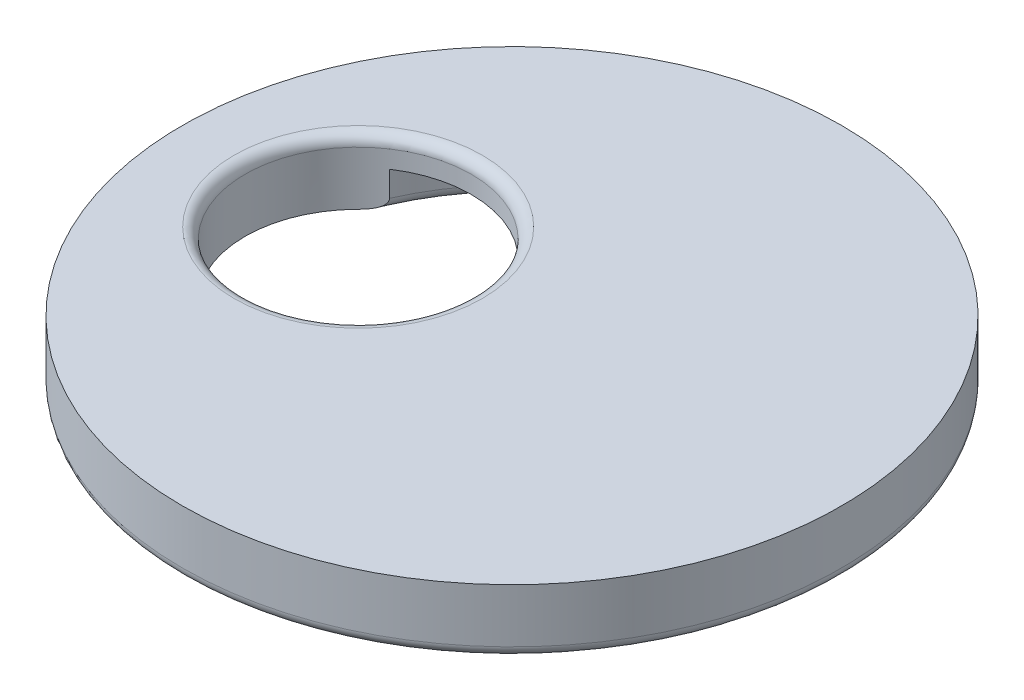
ISO-10303-21;
HEADER;
FILE_DESCRIPTION(('STEP AP214'),'2;1');
FILE_NAME('part.step','',(''),(''),'','','');
FILE_SCHEMA(('AUTOMOTIVE_DESIGN { 1 0 10303 214 1 1 1 1 }'));
ENDSEC;
DATA;
#1=APPLICATION_CONTEXT('core data for automotive mechanical design processes');
#2=APPLICATION_PROTOCOL_DEFINITION('international standard','automotive_design',2000,#1);
#3=PRODUCT_CONTEXT('',#1,'mechanical');
#4=PRODUCT('Part','Part','',(#3));
#5=PRODUCT_RELATED_PRODUCT_CATEGORY('part','',(#4));
#6=PRODUCT_DEFINITION_FORMATION('','',#4);
#7=PRODUCT_DEFINITION_CONTEXT('part definition',#1,'design');
#8=PRODUCT_DEFINITION('design','',#6,#7);
#9=PRODUCT_DEFINITION_SHAPE('','',#8);
#10=(LENGTH_UNIT() NAMED_UNIT(*) SI_UNIT(.MILLI.,.METRE.));
#11=(NAMED_UNIT(*) PLANE_ANGLE_UNIT() SI_UNIT($,.RADIAN.));
#12=(NAMED_UNIT(*) SI_UNIT($,.STERADIAN.) SOLID_ANGLE_UNIT());
#13=UNCERTAINTY_MEASURE_WITH_UNIT(LENGTH_MEASURE(1.E-05),#10,'distance_accuracy_value','');
#14=(GEOMETRIC_REPRESENTATION_CONTEXT(3) GLOBAL_UNCERTAINTY_ASSIGNED_CONTEXT((#13)) GLOBAL_UNIT_ASSIGNED_CONTEXT((#10,
#11,#12)) REPRESENTATION_CONTEXT('',''));
#15=CARTESIAN_POINT('',(0.,0.,0.));
#16=DIRECTION('',(0.,0.,1.));
#17=DIRECTION('',(1.,0.,0.));
#18=AXIS2_PLACEMENT_3D('',#15,#16,#17);
#19=CARTESIAN_POINT('',(0.,0.,0.));
#20=DIRECTION('',(0.,1.,0.));
#21=DIRECTION('',(0.,0.,1.));
#22=AXIS2_PLACEMENT_3D('',#19,#20,#21);
#23=PLANE('',#22);
#24=CARTESIAN_POINT('',(0.,0.,0.));
#25=DIRECTION('',(0.,1.,0.));
#26=DIRECTION('',(0.,0.,1.));
#27=AXIS2_PLACEMENT_3D('',#24,#25,#26);
#28=CIRCLE('',#27,10.75);
#29=CARTESIAN_POINT('',(-9.86,0.,4.28286119317449));
#30=VERTEX_POINT('',#29);
#31=CARTESIAN_POINT('',(-9.86,0.,-4.28286119317449));
#32=VERTEX_POINT('',#31);
#33=EDGE_CURVE('E77',#30,#32,#28,.T.);
#34=ORIENTED_EDGE('',*,*,#33,.F.);
#35=CARTESIAN_POINT('',(-7.,0.,0.));
#36=DIRECTION('',(0.,1.,0.));
#37=DIRECTION('',(0.,0.,1.));
#38=AXIS2_PLACEMENT_3D('',#35,#36,#37);
#39=CIRCLE('',#38,5.15);
#40=EDGE_CURVE('E85',#30,#32,#39,.T.);
#41=ORIENTED_EDGE('',*,*,#40,.T.);
#42=EDGE_LOOP('',(#34,#41));
#43=FACE_BOUND('',#42,.T.);
#44=ADVANCED_FACE('F42',(#43),#23,.F.);
#45=CARTESIAN_POINT('',(-7.,1.3,0.));
#46=DIRECTION('',(0.,-1.,0.));
#47=DIRECTION('',(0.,0.,-1.));
#48=AXIS2_PLACEMENT_3D('',#45,#46,#47);
#49=CYLINDRICAL_SURFACE('',#48,5.15);
#50=CARTESIAN_POINT('',(-7.,0.8,0.));
#51=DIRECTION('',(0.,1.,0.));
#52=DIRECTION('',(0.,0.,1.));
#53=AXIS2_PLACEMENT_3D('',#50,#51,#52);
#54=CIRCLE('',#53,5.15);
#55=CARTESIAN_POINT('',(-7.,0.8,5.15));
#56=VERTEX_POINT('',#55);
#57=EDGE_CURVE('E86',#56,#56,#54,.T.);
#58=ORIENTED_EDGE('',*,*,#57,.T.);
#59=EDGE_LOOP('',(#58));
#60=FACE_BOUND('',#59,.T.);
#61=CARTESIAN_POINT('',(-7.,-1.65,0.));
#62=DIRECTION('',(0.,1.,0.));
#63=DIRECTION('',(0.,0.,1.));
#64=AXIS2_PLACEMENT_3D('',#61,#62,#63);
#65=CIRCLE('',#64,5.15);
#66=CARTESIAN_POINT('',(-10.6457142857143,-1.65,-3.6374809067456));
#67=VERTEX_POINT('',#66);
#68=CARTESIAN_POINT('',(-10.6457142857143,-1.65,3.6374809067456));
#69=VERTEX_POINT('',#68);
#70=EDGE_CURVE('E81',#67,#69,#65,.T.);
#71=ORIENTED_EDGE('',*,*,#70,.F.);
#72=CARTESIAN_POINT('',(-10.6457142857143,-1.65,-3.6374809067456));
#73=CARTESIAN_POINT('',(-10.6089557136245,-1.64996611674412,-3.67433289593063));
#74=CARTESIAN_POINT('',(-10.5715983490033,-1.64842590090176,-3.71064772213373));
#75=CARTESIAN_POINT('',(-10.4957370130442,-1.64174397657124,-3.78220025025339));
#76=CARTESIAN_POINT('',(-10.4572272560529,-1.63657940180842,-3.8174296228198));
#77=CARTESIAN_POINT('',(-10.3791250164166,-1.62195910434838,-3.88674379817724));
#78=CARTESIAN_POINT('',(-10.3395251000964,-1.61245298273011,-3.92080996053041));
#79=CARTESIAN_POINT('',(-10.2603388803773,-1.58821776234701,-3.98689486010416));
#80=CARTESIAN_POINT('',(-10.220752889305,-1.57350434164138,-4.01891940631929));
#81=CARTESIAN_POINT('',(-10.159360452529,-1.54520090062229,-4.06715515825471));
#82=CARTESIAN_POINT('',(-10.1372201989455,-1.53384261734052,-4.08425056779766));
#83=CARTESIAN_POINT('',(-10.0935962837302,-1.50860036132807,-4.11739109482864));
#84=CARTESIAN_POINT('',(-10.0721122800573,-1.49471773147162,-4.13343676460386));
#85=CARTESIAN_POINT('',(-10.0301225046417,-1.46384349321468,-4.16431779207818));
#86=CARTESIAN_POINT('',(-10.0096270351508,-1.44682553735272,-4.17914122334314));
#87=CARTESIAN_POINT('',(-9.9706996021452,-1.40922568617012,-4.20690035354195));
#88=CARTESIAN_POINT('',(-9.95226335904804,-1.38865141748679,-4.21983998513581));
#89=CARTESIAN_POINT('',(-9.92512174453921,-1.35193483527052,-4.23867045466016));
#90=CARTESIAN_POINT('',(-9.91535403109541,-1.33700799583032,-4.24538875312143));
#91=CARTESIAN_POINT('',(-9.89769671025232,-1.30555747739975,-4.25746024473099));
#92=CARTESIAN_POINT('',(-9.88980544148874,-1.28903522931484,-4.2628146457466));
#93=CARTESIAN_POINT('',(-9.87745895810687,-1.25707520041382,-4.27115644668831));
#94=CARTESIAN_POINT('',(-9.87267136612987,-1.24182775714362,-4.27437453049847));
#95=CARTESIAN_POINT('',(-9.8652786760813,-1.21059899730107,-4.27933398246775));
#96=CARTESIAN_POINT('',(-9.8626684149693,-1.19461951215542,-4.28107884415571));
#97=CARTESIAN_POINT('',(-9.86041437847799,-1.16903164599226,-4.2825843214463));
#98=CARTESIAN_POINT('',(-9.85999092344709,-1.15951550669135,-4.28286664431448));
#99=CARTESIAN_POINT('',(-9.86,-1.15,-4.28286119317449));
#100=B_SPLINE_CURVE_WITH_KNOTS('',3,(#72,#73,#74,#75,#76,#77,#78,#79,#80,#81,#82,#83,#84,#85,
#86,#87,#88,#89,#90,#91,#92,#93,#94,#95,#96,#97,#98,#99),.UNSPECIFIED.,.F.,.F.,(4,2,2,2,2,2,2,2,
2,2,2,2,2,4),(0.,0.156190303059865,0.313374982973884,0.472432635019737,0.631015416503463,
0.72148621711328,0.811909030113762,0.903129569136118,0.994156856085308,1.05118002073822,
1.10815250872515,1.15686083557314,1.20545333079016,1.23399206052246),.UNSPECIFIED.);
#101=CARTESIAN_POINT('',(-9.86,-1.15,-4.28286119317449));
#102=VERTEX_POINT('',#101);
#103=EDGE_CURVE('E57',#67,#102,#100,.T.);
#104=ORIENTED_EDGE('',*,*,#103,.T.);
#105=DIRECTION('',(0.,1.,0.));
#106=VECTOR('',#105,1.);
#107=CARTESIAN_POINT('',(-9.86,-1.65,-4.28286119317449));
#108=LINE('',#107,#106);
#109=EDGE_CURVE('E80',#102,#32,#108,.T.);
#110=ORIENTED_EDGE('',*,*,#109,.T.);
#111=ORIENTED_EDGE('',*,*,#40,.F.);
#112=DIRECTION('',(0.,1.,0.));
#113=VECTOR('',#112,1.);
#114=CARTESIAN_POINT('',(-9.86,-1.65,4.28286119317449));
#115=LINE('',#114,#113);
#116=CARTESIAN_POINT('',(-9.86,-1.15,4.28286119317449));
#117=VERTEX_POINT('',#116);
#118=EDGE_CURVE('E74',#117,#30,#115,.T.);
#119=ORIENTED_EDGE('',*,*,#118,.F.);
#120=CARTESIAN_POINT('',(-9.86,-1.15,4.28286119317449));
#121=CARTESIAN_POINT('',(-9.85996748253735,-1.16617725907413,4.28288043979074));
#122=CARTESIAN_POINT('',(-9.8612038318693,-1.18231387853373,4.28205738160039));
#123=CARTESIAN_POINT('',(-9.86593131796034,-1.21396602525333,4.27889600484977));
#124=CARTESIAN_POINT('',(-9.86940321177531,-1.22948566408588,4.27657061735449));
#125=CARTESIAN_POINT('',(-9.87831469467314,-1.25960981651253,4.2705773795001));
#126=CARTESIAN_POINT('',(-9.88374868632783,-1.27421679605062,4.26691334764718));
#127=CARTESIAN_POINT('',(-9.89622823839154,-1.30239875371963,4.2584527304072));
#128=CARTESIAN_POINT('',(-9.90327740965286,-1.31597132736884,4.25365360665181));
#129=CARTESIAN_POINT('',(-9.92370349427746,-1.35056270007741,4.23965720625206));
#130=CARTESIAN_POINT('',(-9.93818966702656,-1.37059636046484,4.22964532588882));
#131=CARTESIAN_POINT('',(-9.96939440094707,-1.4077022784752,4.20779803726618));
#132=CARTESIAN_POINT('',(-9.98611893484587,-1.42476632173686,4.19595773667104));
#133=CARTESIAN_POINT('',(-10.0328473045169,-1.46703191466904,4.16240628185908));
#134=CARTESIAN_POINT('',(-10.0641237690659,-1.48983861206466,4.13947362348005));
#135=CARTESIAN_POINT('',(-10.1283690362491,-1.52965338505145,4.09114196378839));
#136=CARTESIAN_POINT('',(-10.1613419665096,-1.5466464658771,4.06573679860064));
#137=CARTESIAN_POINT('',(-10.2254349974221,-1.57491922514408,4.01504841561388));
#138=CARTESIAN_POINT('',(-10.2565141748396,-1.5865259343421,3.98989224520319));
#139=CARTESIAN_POINT('',(-10.3187012919648,-1.60642871088392,3.93831950631171));
#140=CARTESIAN_POINT('',(-10.3498092323542,-1.61472178556118,3.91190182250426));
#141=CARTESIAN_POINT('',(-10.4426946472233,-1.63539158080505,3.83106592802481));
#142=CARTESIAN_POINT('',(-10.5040542832431,-1.64356702578367,3.77504868309832));
#143=CARTESIAN_POINT('',(-10.5778301295234,-1.64827978166758,3.70432183397424));
#144=CARTESIAN_POINT('',(-10.5915280174629,-1.64893071763511,3.69104228170489));
#145=CARTESIAN_POINT('',(-10.61874501836,-1.64979063210643,3.66436136222856));
#146=CARTESIAN_POINT('',(-10.6322645189796,-1.6500008194654,3.650960429726));
#147=CARTESIAN_POINT('',(-10.6457142857143,-1.65,3.6374809067456));
#148=B_SPLINE_CURVE_WITH_KNOTS('',3,(#120,#121,#122,#123,#124,#125,#126,#127,#128,#129,#130,
#131,#132,#133,#134,#135,#136,#137,#138,#139,#140,#141,#142,#143,#144,#145,#146,#147),
.UNSPECIFIED.,.F.,.F.,(4,2,2,2,2,2,2,2,2,2,2,2,2,4),(0.,0.0483991386785642,0.0963871414812369,
0.144239313014386,0.192199523763889,0.271755821651159,0.351528801016755,0.485747693622444,
0.620310205374138,0.745028467390531,0.869859113884445,1.11943896639548,1.17670746719737,
1.2338186893129),.UNSPECIFIED.);
#149=EDGE_CURVE('E106',#117,#69,#148,.T.);
#150=ORIENTED_EDGE('',*,*,#149,.T.);
#151=EDGE_LOOP('',(#71,#104,#110,#111,#119,#150));
#152=FACE_BOUND('',#151,.T.);
#153=ADVANCED_FACE('F89',(#60,#152),#49,.F.);
#154=CARTESIAN_POINT('',(0.,1.3,0.));
#155=DIRECTION('',(0.,-1.,0.));
#156=DIRECTION('',(0.,0.,-1.));
#157=AXIS2_PLACEMENT_3D('',#154,#155,#156);
#158=CYLINDRICAL_SURFACE('',#157,15.);
#159=CARTESIAN_POINT('',(0.,-1.15,0.));
#160=DIRECTION('',(0.,1.,0.));
#161=DIRECTION('',(0.,0.,1.));
#162=AXIS2_PLACEMENT_3D('',#159,#160,#161);
#163=CIRCLE('',#162,15.);
#164=CARTESIAN_POINT('',(0.,-1.15,15.));
#165=VERTEX_POINT('',#164);
#166=EDGE_CURVE('E12',#165,#165,#163,.T.);
#167=ORIENTED_EDGE('',*,*,#166,.T.);
#168=EDGE_LOOP('',(#167));
#169=FACE_BOUND('',#168,.T.);
#170=CARTESIAN_POINT('',(0.,1.3,0.));
#171=DIRECTION('',(0.,1.,0.));
#172=DIRECTION('',(0.,0.,1.));
#173=AXIS2_PLACEMENT_3D('',#170,#171,#172);
#174=CIRCLE('',#173,15.);
#175=CARTESIAN_POINT('',(0.,1.3,15.));
#176=VERTEX_POINT('',#175);
#177=EDGE_CURVE('E87',#176,#176,#174,.T.);
#178=ORIENTED_EDGE('',*,*,#177,.F.);
#179=EDGE_LOOP('',(#178));
#180=FACE_BOUND('',#179,.T.);
#181=ADVANCED_FACE('F140',(#169,#180),#158,.T.);
#182=CARTESIAN_POINT('',(0.,1.3,0.));
#183=DIRECTION('',(0.,1.,0.));
#184=DIRECTION('',(0.,0.,1.));
#185=AXIS2_PLACEMENT_3D('',#182,#183,#184);
#186=PLANE('',#185);
#187=CARTESIAN_POINT('',(-7.,1.3,0.));
#188=DIRECTION('',(0.,1.,0.));
#189=DIRECTION('',(0.,0.,1.));
#190=AXIS2_PLACEMENT_3D('',#187,#188,#189);
#191=CIRCLE('',#190,5.65);
#192=CARTESIAN_POINT('',(-7.,1.3,5.65));
#193=VERTEX_POINT('',#192);
#194=EDGE_CURVE('E97',#193,#193,#191,.F.);
#195=ORIENTED_EDGE('',*,*,#194,.T.);
#196=EDGE_LOOP('',(#195));
#197=FACE_BOUND('',#196,.T.);
#198=ORIENTED_EDGE('',*,*,#177,.T.);
#199=EDGE_LOOP('',(#198));
#200=FACE_BOUND('',#199,.T.);
#201=ADVANCED_FACE('F143',(#197,#200),#186,.T.);
#202=CARTESIAN_POINT('',(0.,-1.65,0.));
#203=DIRECTION('',(0.,1.,0.));
#204=DIRECTION('',(0.,0.,1.));
#205=AXIS2_PLACEMENT_3D('',#202,#203,#204);
#206=PLANE('',#205);
#207=CARTESIAN_POINT('',(0.,-1.65,0.));
#208=DIRECTION('',(0.,1.,0.));
#209=DIRECTION('',(0.,0.,1.));
#210=AXIS2_PLACEMENT_3D('',#207,#208,#209);
#211=CIRCLE('',#210,14.5);
#212=CARTESIAN_POINT('',(0.,-1.65,14.5));
#213=VERTEX_POINT('',#212);
#214=EDGE_CURVE('E100',#213,#213,#211,.F.);
#215=ORIENTED_EDGE('',*,*,#214,.T.);
#216=EDGE_LOOP('',(#215));
#217=FACE_BOUND('',#216,.T.);
#218=ORIENTED_EDGE('',*,*,#70,.T.);
#219=CARTESIAN_POINT('',(0.,-1.65,0.));
#220=DIRECTION('',(0.,1.,0.));
#221=DIRECTION('',(0.,0.,1.));
#222=AXIS2_PLACEMENT_3D('',#219,#220,#221);
#223=CIRCLE('',#222,11.25);
#224=EDGE_CURVE('E103',#69,#67,#223,.T.);
#225=ORIENTED_EDGE('',*,*,#224,.T.);
#226=EDGE_LOOP('',(#218,#225));
#227=FACE_BOUND('',#226,.T.);
#228=ADVANCED_FACE('F131',(#217,#227),#206,.F.);
#229=CARTESIAN_POINT('',(0.,-1.65,0.));
#230=DIRECTION('',(0.,1.,0.));
#231=DIRECTION('',(0.,0.,1.));
#232=AXIS2_PLACEMENT_3D('',#229,#230,#231);
#233=CYLINDRICAL_SURFACE('',#232,10.75);
#234=ORIENTED_EDGE('',*,*,#109,.F.);
#235=CARTESIAN_POINT('',(0.,-1.15,0.));
#236=DIRECTION('',(0.,1.,0.));
#237=DIRECTION('',(0.,0.,1.));
#238=AXIS2_PLACEMENT_3D('',#235,#236,#237);
#239=CIRCLE('',#238,10.75);
#240=EDGE_CURVE('E50',#102,#117,#239,.F.);
#241=ORIENTED_EDGE('',*,*,#240,.T.);
#242=ORIENTED_EDGE('',*,*,#118,.T.);
#243=ORIENTED_EDGE('',*,*,#33,.T.);
#244=EDGE_LOOP('',(#234,#241,#242,#243));
#245=FACE_BOUND('',#244,.T.);
#246=ADVANCED_FACE('F76',(#245),#233,.F.);
#247=CARTESIAN_POINT('',(-7.,0.8,0.));
#248=DIRECTION('',(0.,1.,0.));
#249=DIRECTION('',(0.,0.,1.));
#250=AXIS2_PLACEMENT_3D('',#247,#248,#249);
#251=TOROIDAL_SURFACE('',#250,5.65,0.5);
#252=ORIENTED_EDGE('',*,*,#194,.F.);
#253=EDGE_LOOP('',(#252));
#254=FACE_BOUND('',#253,.T.);
#255=ORIENTED_EDGE('',*,*,#57,.F.);
#256=EDGE_LOOP('',(#255));
#257=FACE_BOUND('',#256,.T.);
#258=ADVANCED_FACE('F123',(#254,#257),#251,.T.);
#259=CARTESIAN_POINT('',(0.,-1.15,0.));
#260=DIRECTION('',(0.,1.,0.));
#261=DIRECTION('',(0.,0.,1.));
#262=AXIS2_PLACEMENT_3D('',#259,#260,#261);
#263=TOROIDAL_SURFACE('',#262,11.25,0.5);
#264=ORIENTED_EDGE('',*,*,#149,.F.);
#265=ORIENTED_EDGE('',*,*,#240,.F.);
#266=ORIENTED_EDGE('',*,*,#103,.F.);
#267=ORIENTED_EDGE('',*,*,#224,.F.);
#268=EDGE_LOOP('',(#264,#265,#266,#267));
#269=FACE_BOUND('',#268,.T.);
#270=ADVANCED_FACE('F120',(#269),#263,.T.);
#271=CARTESIAN_POINT('',(0.,-1.15,0.));
#272=DIRECTION('',(0.,1.,0.));
#273=DIRECTION('',(0.,0.,1.));
#274=AXIS2_PLACEMENT_3D('',#271,#272,#273);
#275=TOROIDAL_SURFACE('',#274,14.5,0.5);
#276=ORIENTED_EDGE('',*,*,#214,.F.);
#277=EDGE_LOOP('',(#276));
#278=FACE_BOUND('',#277,.T.);
#279=ORIENTED_EDGE('',*,*,#166,.F.);
#280=EDGE_LOOP('',(#279));
#281=FACE_BOUND('',#280,.T.);
#282=ADVANCED_FACE('F44',(#278,#281),#275,.T.);
#283=CLOSED_SHELL('',(#44,#153,#181,#201,#228,#246,#258,#270,#282));
#284=MANIFOLD_SOLID_BREP('B2',#283);
#285=ADVANCED_BREP_SHAPE_REPRESENTATION('',(#18,#284),#14);
#286=SHAPE_DEFINITION_REPRESENTATION(#9,#285);
ENDSEC;
END-ISO-10303-21;
